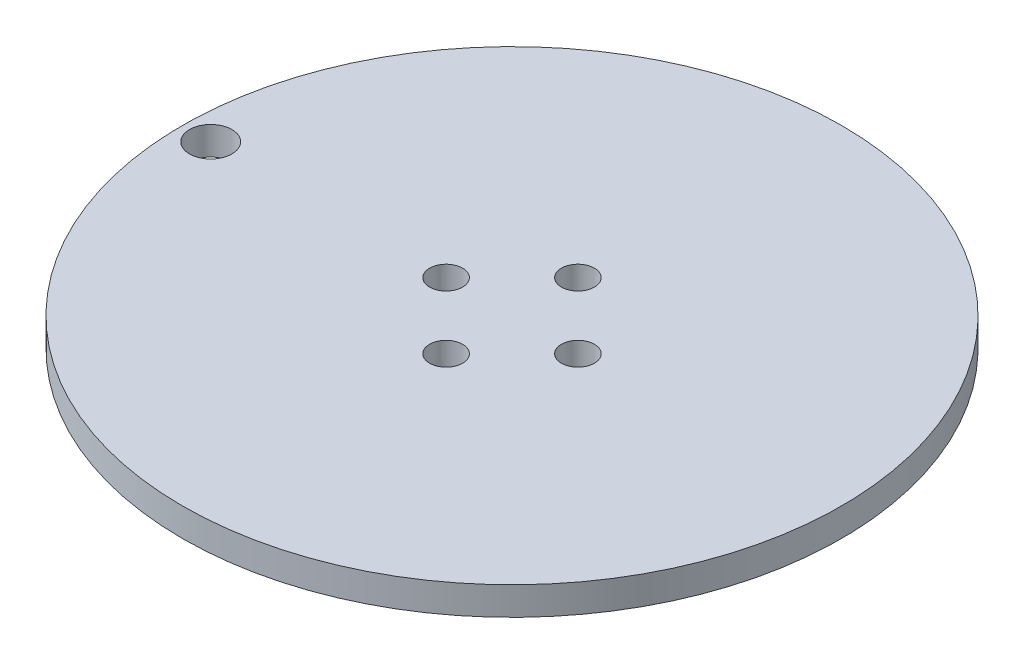
ISO-10303-21;
HEADER;
FILE_DESCRIPTION(('STEP AP214'),'2;1');
FILE_NAME('part.step','',(''),(''),'','','');
FILE_SCHEMA(('AUTOMOTIVE_DESIGN { 1 0 10303 214 1 1 1 1 }'));
ENDSEC;
DATA;
#1=APPLICATION_CONTEXT('core data for automotive mechanical design processes');
#2=APPLICATION_PROTOCOL_DEFINITION('international standard','automotive_design',2000,#1);
#3=PRODUCT_CONTEXT('',#1,'mechanical');
#4=PRODUCT('Part','Part','',(#3));
#5=PRODUCT_RELATED_PRODUCT_CATEGORY('part','',(#4));
#6=PRODUCT_DEFINITION_FORMATION('','',#4);
#7=PRODUCT_DEFINITION_CONTEXT('part definition',#1,'design');
#8=PRODUCT_DEFINITION('design','',#6,#7);
#9=PRODUCT_DEFINITION_SHAPE('','',#8);
#10=(LENGTH_UNIT() NAMED_UNIT(*) SI_UNIT(.MILLI.,.METRE.));
#11=(NAMED_UNIT(*) PLANE_ANGLE_UNIT() SI_UNIT($,.RADIAN.));
#12=(NAMED_UNIT(*) SI_UNIT($,.STERADIAN.) SOLID_ANGLE_UNIT());
#13=UNCERTAINTY_MEASURE_WITH_UNIT(LENGTH_MEASURE(1.E-05),#10,'distance_accuracy_value','');
#14=(GEOMETRIC_REPRESENTATION_CONTEXT(3) GLOBAL_UNCERTAINTY_ASSIGNED_CONTEXT((#13)) GLOBAL_UNIT_ASSIGNED_CONTEXT((#10,
#11,#12)) REPRESENTATION_CONTEXT('',''));
#15=CARTESIAN_POINT('',(0.,0.,0.));
#16=DIRECTION('',(0.,0.,1.));
#17=DIRECTION('',(1.,0.,0.));
#18=AXIS2_PLACEMENT_3D('',#15,#16,#17);
#19=CARTESIAN_POINT('',(0.,3.,0.));
#20=DIRECTION('',(0.,1.,0.));
#21=DIRECTION('',(0.,0.,1.));
#22=AXIS2_PLACEMENT_3D('',#19,#20,#21);
#23=PLANE('',#22);
#24=CARTESIAN_POINT('',(7.,3.,0.));
#25=DIRECTION('',(0.,1.,0.));
#26=DIRECTION('',(0.,0.,1.));
#27=AXIS2_PLACEMENT_3D('',#24,#25,#26);
#28=CIRCLE('',#27,1.75);
#29=CARTESIAN_POINT('',(7.,3.,1.75));
#30=VERTEX_POINT('',#29);
#31=EDGE_CURVE('E72',#30,#30,#28,.T.);
#32=ORIENTED_EDGE('',*,*,#31,.F.);
#33=EDGE_LOOP('',(#32));
#34=FACE_BOUND('',#33,.T.);
#35=CARTESIAN_POINT('',(-32.,3.,0.));
#36=DIRECTION('',(0.,1.,0.));
#37=DIRECTION('',(0.,0.,1.));
#38=AXIS2_PLACEMENT_3D('',#35,#36,#37);
#39=CIRCLE('',#38,2.25);
#40=CARTESIAN_POINT('',(-32.,3.,2.25000000000001));
#41=VERTEX_POINT('',#40);
#42=EDGE_CURVE('E56',#41,#41,#39,.T.);
#43=ORIENTED_EDGE('',*,*,#42,.F.);
#44=EDGE_LOOP('',(#43));
#45=FACE_BOUND('',#44,.T.);
#46=CARTESIAN_POINT('',(0.,3.,0.));
#47=DIRECTION('',(0.,1.,0.));
#48=DIRECTION('',(0.,0.,1.));
#49=AXIS2_PLACEMENT_3D('',#46,#47,#48);
#50=CIRCLE('',#49,35.);
#51=CARTESIAN_POINT('',(0.,3.,35.));
#52=VERTEX_POINT('',#51);
#53=EDGE_CURVE('E10',#52,#52,#50,.T.);
#54=ORIENTED_EDGE('',*,*,#53,.T.);
#55=EDGE_LOOP('',(#54));
#56=FACE_BOUND('',#55,.T.);
#57=CARTESIAN_POINT('',(-7.,3.,0.));
#58=DIRECTION('',(0.,1.,0.));
#59=DIRECTION('',(0.,0.,1.));
#60=AXIS2_PLACEMENT_3D('',#57,#58,#59);
#61=CIRCLE('',#60,1.75);
#62=CARTESIAN_POINT('',(-7.,3.,1.75));
#63=VERTEX_POINT('',#62);
#64=EDGE_CURVE('E50',#63,#63,#61,.T.);
#65=ORIENTED_EDGE('',*,*,#64,.F.);
#66=EDGE_LOOP('',(#65));
#67=FACE_BOUND('',#66,.T.);
#68=CARTESIAN_POINT('',(0.,3.,-7.));
#69=DIRECTION('',(0.,1.,0.));
#70=DIRECTION('',(0.,0.,1.));
#71=AXIS2_PLACEMENT_3D('',#68,#69,#70);
#72=CIRCLE('',#71,1.75);
#73=CARTESIAN_POINT('',(0.,3.,-5.25));
#74=VERTEX_POINT('',#73);
#75=EDGE_CURVE('E64',#74,#74,#72,.T.);
#76=ORIENTED_EDGE('',*,*,#75,.F.);
#77=EDGE_LOOP('',(#76));
#78=FACE_BOUND('',#77,.T.);
#79=CARTESIAN_POINT('',(0.,3.,7.));
#80=DIRECTION('',(0.,1.,0.));
#81=DIRECTION('',(0.,0.,1.));
#82=AXIS2_PLACEMENT_3D('',#79,#80,#81);
#83=CIRCLE('',#82,1.75);
#84=CARTESIAN_POINT('',(0.,3.,8.75));
#85=VERTEX_POINT('',#84);
#86=EDGE_CURVE('E80',#85,#85,#83,.T.);
#87=ORIENTED_EDGE('',*,*,#86,.F.);
#88=EDGE_LOOP('',(#87));
#89=FACE_BOUND('',#88,.T.);
#90=ADVANCED_FACE('F37',(#34,#45,#56,#67,#78,#89),#23,.T.);
#91=CARTESIAN_POINT('',(0.,0.,0.));
#92=DIRECTION('',(0.,1.,0.));
#93=DIRECTION('',(0.,0.,1.));
#94=AXIS2_PLACEMENT_3D('',#91,#92,#93);
#95=PLANE('',#94);
#96=CARTESIAN_POINT('',(0.,0.,0.));
#97=DIRECTION('',(0.,1.,0.));
#98=DIRECTION('',(0.,0.,1.));
#99=AXIS2_PLACEMENT_3D('',#96,#97,#98);
#100=CIRCLE('',#99,35.);
#101=CARTESIAN_POINT('',(0.,0.,35.));
#102=VERTEX_POINT('',#101);
#103=EDGE_CURVE('E41',#102,#102,#100,.T.);
#104=ORIENTED_EDGE('',*,*,#103,.F.);
#105=EDGE_LOOP('',(#104));
#106=FACE_BOUND('',#105,.T.);
#107=CARTESIAN_POINT('',(-7.,0.,0.));
#108=DIRECTION('',(0.,1.,0.));
#109=DIRECTION('',(0.,0.,1.));
#110=AXIS2_PLACEMENT_3D('',#107,#108,#109);
#111=CIRCLE('',#110,1.75);
#112=CARTESIAN_POINT('',(-7.,0.,1.75));
#113=VERTEX_POINT('',#112);
#114=EDGE_CURVE('E52',#113,#113,#111,.T.);
#115=ORIENTED_EDGE('',*,*,#114,.T.);
#116=EDGE_LOOP('',(#115));
#117=FACE_BOUND('',#116,.T.);
#118=CARTESIAN_POINT('',(-32.,0.,0.));
#119=DIRECTION('',(0.,1.,0.));
#120=DIRECTION('',(0.,0.,1.));
#121=AXIS2_PLACEMENT_3D('',#118,#119,#120);
#122=CIRCLE('',#121,2.25);
#123=CARTESIAN_POINT('',(-32.,0.,2.25000000000001));
#124=VERTEX_POINT('',#123);
#125=EDGE_CURVE('E60',#124,#124,#122,.T.);
#126=ORIENTED_EDGE('',*,*,#125,.T.);
#127=EDGE_LOOP('',(#126));
#128=FACE_BOUND('',#127,.T.);
#129=CARTESIAN_POINT('',(0.,0.,-7.));
#130=DIRECTION('',(0.,1.,0.));
#131=DIRECTION('',(0.,0.,1.));
#132=AXIS2_PLACEMENT_3D('',#129,#130,#131);
#133=CIRCLE('',#132,1.75);
#134=CARTESIAN_POINT('',(0.,0.,-5.25));
#135=VERTEX_POINT('',#134);
#136=EDGE_CURVE('E68',#135,#135,#133,.T.);
#137=ORIENTED_EDGE('',*,*,#136,.T.);
#138=EDGE_LOOP('',(#137));
#139=FACE_BOUND('',#138,.T.);
#140=CARTESIAN_POINT('',(7.,0.,0.));
#141=DIRECTION('',(0.,1.,0.));
#142=DIRECTION('',(0.,0.,1.));
#143=AXIS2_PLACEMENT_3D('',#140,#141,#142);
#144=CIRCLE('',#143,1.75);
#145=CARTESIAN_POINT('',(7.,0.,1.75));
#146=VERTEX_POINT('',#145);
#147=EDGE_CURVE('E76',#146,#146,#144,.T.);
#148=ORIENTED_EDGE('',*,*,#147,.T.);
#149=EDGE_LOOP('',(#148));
#150=FACE_BOUND('',#149,.T.);
#151=CARTESIAN_POINT('',(0.,0.,7.));
#152=DIRECTION('',(0.,1.,0.));
#153=DIRECTION('',(0.,0.,1.));
#154=AXIS2_PLACEMENT_3D('',#151,#152,#153);
#155=CIRCLE('',#154,1.75);
#156=CARTESIAN_POINT('',(0.,0.,8.75));
#157=VERTEX_POINT('',#156);
#158=EDGE_CURVE('E84',#157,#157,#155,.T.);
#159=ORIENTED_EDGE('',*,*,#158,.T.);
#160=EDGE_LOOP('',(#159));
#161=FACE_BOUND('',#160,.T.);
#162=ADVANCED_FACE('F96',(#106,#117,#128,#139,#150,#161),#95,.F.);
#163=CARTESIAN_POINT('',(0.,3.,0.));
#164=DIRECTION('',(0.,-1.,0.));
#165=DIRECTION('',(0.,0.,-1.));
#166=AXIS2_PLACEMENT_3D('',#163,#164,#165);
#167=CYLINDRICAL_SURFACE('',#166,35.);
#168=ORIENTED_EDGE('',*,*,#53,.F.);
#169=EDGE_LOOP('',(#168));
#170=FACE_BOUND('',#169,.T.);
#171=ORIENTED_EDGE('',*,*,#103,.T.);
#172=EDGE_LOOP('',(#171));
#173=FACE_BOUND('',#172,.T.);
#174=ADVANCED_FACE('F39',(#170,#173),#167,.T.);
#175=CARTESIAN_POINT('',(-7.,3.,0.));
#176=DIRECTION('',(0.,-1.,0.));
#177=DIRECTION('',(0.,0.,-1.));
#178=AXIS2_PLACEMENT_3D('',#175,#176,#177);
#179=CYLINDRICAL_SURFACE('',#178,1.75);
#180=ORIENTED_EDGE('',*,*,#64,.T.);
#181=EDGE_LOOP('',(#180));
#182=FACE_BOUND('',#181,.T.);
#183=ORIENTED_EDGE('',*,*,#114,.F.);
#184=EDGE_LOOP('',(#183));
#185=FACE_BOUND('',#184,.T.);
#186=ADVANCED_FACE('F106',(#182,#185),#179,.F.);
#187=CARTESIAN_POINT('',(-32.,3.,0.));
#188=DIRECTION('',(0.,-1.,0.));
#189=DIRECTION('',(0.,0.,-1.));
#190=AXIS2_PLACEMENT_3D('',#187,#188,#189);
#191=CYLINDRICAL_SURFACE('',#190,2.25);
#192=ORIENTED_EDGE('',*,*,#42,.T.);
#193=EDGE_LOOP('',(#192));
#194=FACE_BOUND('',#193,.T.);
#195=ORIENTED_EDGE('',*,*,#125,.F.);
#196=EDGE_LOOP('',(#195));
#197=FACE_BOUND('',#196,.T.);
#198=ADVANCED_FACE('F109',(#194,#197),#191,.F.);
#199=CARTESIAN_POINT('',(0.,3.,-7.));
#200=DIRECTION('',(0.,-1.,0.));
#201=DIRECTION('',(0.,0.,-1.));
#202=AXIS2_PLACEMENT_3D('',#199,#200,#201);
#203=CYLINDRICAL_SURFACE('',#202,1.75);
#204=ORIENTED_EDGE('',*,*,#75,.T.);
#205=EDGE_LOOP('',(#204));
#206=FACE_BOUND('',#205,.T.);
#207=ORIENTED_EDGE('',*,*,#136,.F.);
#208=EDGE_LOOP('',(#207));
#209=FACE_BOUND('',#208,.T.);
#210=ADVANCED_FACE('F113',(#206,#209),#203,.F.);
#211=CARTESIAN_POINT('',(7.,3.,0.));
#212=DIRECTION('',(0.,-1.,0.));
#213=DIRECTION('',(0.,0.,-1.));
#214=AXIS2_PLACEMENT_3D('',#211,#212,#213);
#215=CYLINDRICAL_SURFACE('',#214,1.75);
#216=ORIENTED_EDGE('',*,*,#31,.T.);
#217=EDGE_LOOP('',(#216));
#218=FACE_BOUND('',#217,.T.);
#219=ORIENTED_EDGE('',*,*,#147,.F.);
#220=EDGE_LOOP('',(#219));
#221=FACE_BOUND('',#220,.T.);
#222=ADVANCED_FACE('F117',(#218,#221),#215,.F.);
#223=CARTESIAN_POINT('',(0.,3.,7.));
#224=DIRECTION('',(0.,-1.,0.));
#225=DIRECTION('',(0.,0.,-1.));
#226=AXIS2_PLACEMENT_3D('',#223,#224,#225);
#227=CYLINDRICAL_SURFACE('',#226,1.75);
#228=ORIENTED_EDGE('',*,*,#86,.T.);
#229=EDGE_LOOP('',(#228));
#230=FACE_BOUND('',#229,.T.);
#231=ORIENTED_EDGE('',*,*,#158,.F.);
#232=EDGE_LOOP('',(#231));
#233=FACE_BOUND('',#232,.T.);
#234=ADVANCED_FACE('F92',(#230,#233),#227,.F.);
#235=CLOSED_SHELL('',(#90,#162,#174,#186,#198,#210,#222,#234));
#236=MANIFOLD_SOLID_BREP('B2',#235);
#237=ADVANCED_BREP_SHAPE_REPRESENTATION('',(#18,#236),#14);
#238=SHAPE_DEFINITION_REPRESENTATION(#9,#237);
ENDSEC;
END-ISO-10303-21;
